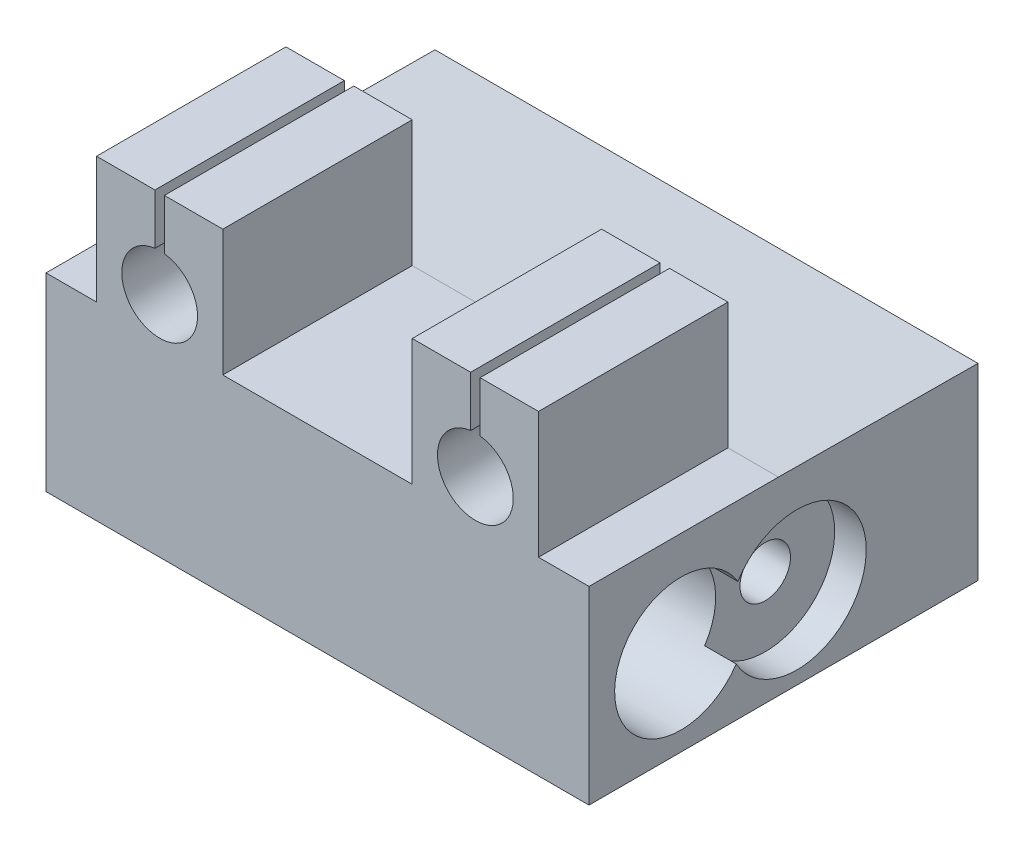
ISO-10303-21;
HEADER;
FILE_DESCRIPTION(('STEP AP214'),'2;1');
FILE_NAME('part.step','',(''),(''),'','','');
FILE_SCHEMA(('AUTOMOTIVE_DESIGN { 1 0 10303 214 1 1 1 1 }'));
ENDSEC;
DATA;
#1=APPLICATION_CONTEXT('core data for automotive mechanical design processes');
#2=APPLICATION_PROTOCOL_DEFINITION('international standard','automotive_design',2000,#1);
#3=PRODUCT_CONTEXT('',#1,'mechanical');
#4=PRODUCT('Part','Part','',(#3));
#5=PRODUCT_RELATED_PRODUCT_CATEGORY('part','',(#4));
#6=PRODUCT_DEFINITION_FORMATION('','',#4);
#7=PRODUCT_DEFINITION_CONTEXT('part definition',#1,'design');
#8=PRODUCT_DEFINITION('design','',#6,#7);
#9=PRODUCT_DEFINITION_SHAPE('','',#8);
#10=(LENGTH_UNIT() NAMED_UNIT(*) SI_UNIT(.MILLI.,.METRE.));
#11=(NAMED_UNIT(*) PLANE_ANGLE_UNIT() SI_UNIT($,.RADIAN.));
#12=(NAMED_UNIT(*) SI_UNIT($,.STERADIAN.) SOLID_ANGLE_UNIT());
#13=UNCERTAINTY_MEASURE_WITH_UNIT(LENGTH_MEASURE(1.E-05),#10,'distance_accuracy_value','');
#14=(GEOMETRIC_REPRESENTATION_CONTEXT(3) GLOBAL_UNCERTAINTY_ASSIGNED_CONTEXT((#13)) GLOBAL_UNIT_ASSIGNED_CONTEXT((#10,
#11,#12)) REPRESENTATION_CONTEXT('',''));
#15=CARTESIAN_POINT('',(0.,0.,0.));
#16=DIRECTION('',(0.,0.,1.));
#17=DIRECTION('',(1.,0.,0.));
#18=AXIS2_PLACEMENT_3D('',#15,#16,#17);
#19=CARTESIAN_POINT('',(54.3137084989848,13.0792641528252,-2.90578026427646));
#20=DIRECTION('',(-1.,0.,0.));
#21=DIRECTION('',(0.,0.,1.));
#22=AXIS2_PLACEMENT_3D('',#19,#20,#21);
#23=CYLINDRICAL_SURFACE('',#22,4.);
#24=CARTESIAN_POINT('',(-38.,13.0792641528252,-2.90578026427646));
#25=DIRECTION('',(-1.,0.,0.));
#26=DIRECTION('',(0.,0.,1.));
#27=AXIS2_PLACEMENT_3D('',#24,#25,#26);
#28=CIRCLE('',#27,4.);
#29=CARTESIAN_POINT('',(-38.,13.0792641528252,1.09421973572354));
#30=VERTEX_POINT('',#29);
#31=EDGE_CURVE('E363',#30,#30,#28,.F.);
#32=ORIENTED_EDGE('',*,*,#31,.F.);
#33=EDGE_LOOP('',(#32));
#34=FACE_BOUND('',#33,.T.);
#35=CARTESIAN_POINT('',(38.,13.0792641528252,-2.90578026427646));
#36=DIRECTION('',(1.,0.,0.));
#37=DIRECTION('',(0.,1.,0.));
#38=AXIS2_PLACEMENT_3D('',#35,#36,#37);
#39=CIRCLE('',#38,4.);
#40=CARTESIAN_POINT('',(38.,17.0792641528252,-2.90578026427646));
#41=VERTEX_POINT('',#40);
#42=EDGE_CURVE('E376',#41,#41,#39,.F.);
#43=ORIENTED_EDGE('',*,*,#42,.F.);
#44=EDGE_LOOP('',(#43));
#45=FACE_BOUND('',#44,.T.);
#46=ADVANCED_FACE('F35',(#34,#45),#23,.F.);
#47=CARTESIAN_POINT('',(-25.,36.0470595501047,0.));
#48=DIRECTION('',(0.,0.,-1.));
#49=DIRECTION('',(-1.,0.,0.));
#50=AXIS2_PLACEMENT_3D('',#47,#48,#49);
#51=PLANE('',#50);
#52=DIRECTION('',(1.,0.,0.));
#53=VECTOR('',#52,1.);
#54=CARTESIAN_POINT('',(-43.,30.,0.));
#55=LINE('',#54,#53);
#56=CARTESIAN_POINT('',(-35.,30.,0.));
#57=VERTEX_POINT('',#56);
#58=CARTESIAN_POINT('',(-15.,30.,0.));
#59=VERTEX_POINT('',#58);
#60=EDGE_CURVE('E371',#57,#59,#55,.T.);
#61=ORIENTED_EDGE('',*,*,#60,.F.);
#62=DIRECTION('',(0.,-1.,0.));
#63=VECTOR('',#62,1.);
#64=CARTESIAN_POINT('',(-35.,30.,0.));
#65=LINE('',#64,#63);
#66=CARTESIAN_POINT('',(-35.,50.,0.));
#67=VERTEX_POINT('',#66);
#68=EDGE_CURVE('E300',#67,#57,#65,.T.);
#69=ORIENTED_EDGE('',*,*,#68,.F.);
#70=DIRECTION('',(-1.,0.,0.));
#71=VECTOR('',#70,1.);
#72=CARTESIAN_POINT('',(-35.,50.,0.));
#73=LINE('',#72,#71);
#74=CARTESIAN_POINT('',(-25.75,50.,0.));
#75=VERTEX_POINT('',#74);
#76=EDGE_CURVE('E298',#75,#67,#73,.T.);
#77=ORIENTED_EDGE('',*,*,#76,.F.);
#78=DIRECTION('',(0.,1.,0.));
#79=VECTOR('',#78,1.);
#80=CARTESIAN_POINT('',(-25.75,50.,0.));
#81=LINE('',#80,#79);
#82=CARTESIAN_POINT('',(-25.75,42.,0.));
#83=VERTEX_POINT('',#82);
#84=EDGE_CURVE('E296',#83,#75,#81,.T.);
#85=ORIENTED_EDGE('',*,*,#84,.F.);
#86=CARTESIAN_POINT('',(-25.,36.0470595501047,0.));
#87=DIRECTION('',(0.,0.,-1.));
#88=DIRECTION('',(-1.,0.,0.));
#89=AXIS2_PLACEMENT_3D('',#86,#87,#88);
#90=CIRCLE('',#89,6.);
#91=CARTESIAN_POINT('',(-24.25,42.,0.));
#92=VERTEX_POINT('',#91);
#93=EDGE_CURVE('E294',#92,#83,#90,.T.);
#94=ORIENTED_EDGE('',*,*,#93,.F.);
#95=DIRECTION('',(0.,-1.,0.));
#96=VECTOR('',#95,1.);
#97=CARTESIAN_POINT('',(-24.25,50.,0.));
#98=LINE('',#97,#96);
#99=CARTESIAN_POINT('',(-24.25,50.,0.));
#100=VERTEX_POINT('',#99);
#101=EDGE_CURVE('E292',#100,#92,#98,.T.);
#102=ORIENTED_EDGE('',*,*,#101,.F.);
#103=DIRECTION('',(-1.,0.,0.));
#104=VECTOR('',#103,1.);
#105=CARTESIAN_POINT('',(-15.,50.,0.));
#106=LINE('',#105,#104);
#107=CARTESIAN_POINT('',(-15.,50.,0.));
#108=VERTEX_POINT('',#107);
#109=EDGE_CURVE('E290',#108,#100,#106,.T.);
#110=ORIENTED_EDGE('',*,*,#109,.F.);
#111=DIRECTION('',(0.,1.,0.));
#112=VECTOR('',#111,1.);
#113=CARTESIAN_POINT('',(-15.,50.,0.));
#114=LINE('',#113,#112);
#115=EDGE_CURVE('E288',#59,#108,#114,.T.);
#116=ORIENTED_EDGE('',*,*,#115,.F.);
#117=EDGE_LOOP('',(#61,#69,#77,#85,#94,#102,#110,#116));
#118=FACE_BOUND('',#117,.T.);
#119=ADVANCED_FACE('F456',(#118),#51,.T.);
#120=CARTESIAN_POINT('',(43.,0.,30.));
#121=DIRECTION('',(0.,1.,0.));
#122=DIRECTION('',(-1.,0.,0.));
#123=AXIS2_PLACEMENT_3D('',#120,#121,#122);
#124=PLANE('',#123);
#125=DIRECTION('',(0.,0.,-1.));
#126=VECTOR('',#125,1.);
#127=CARTESIAN_POINT('',(-43.,0.,30.));
#128=LINE('',#127,#126);
#129=CARTESIAN_POINT('',(-43.,0.,30.));
#130=VERTEX_POINT('',#129);
#131=CARTESIAN_POINT('',(-43.,0.,-31.6003459635326));
#132=VERTEX_POINT('',#131);
#133=EDGE_CURVE('E269',#130,#132,#128,.T.);
#134=ORIENTED_EDGE('',*,*,#133,.T.);
#135=DIRECTION('',(1.,0.,0.));
#136=VECTOR('',#135,1.);
#137=CARTESIAN_POINT('',(-43.,0.,-31.6003459635326));
#138=LINE('',#137,#136);
#139=CARTESIAN_POINT('',(43.,0.,-31.6003459635326));
#140=VERTEX_POINT('',#139);
#141=EDGE_CURVE('E226',#132,#140,#138,.T.);
#142=ORIENTED_EDGE('',*,*,#141,.T.);
#143=DIRECTION('',(0.,0.,-1.));
#144=VECTOR('',#143,1.);
#145=CARTESIAN_POINT('',(43.,0.,30.));
#146=LINE('',#145,#144);
#147=CARTESIAN_POINT('',(43.,0.,30.));
#148=VERTEX_POINT('',#147);
#149=EDGE_CURVE('E360',#148,#140,#146,.T.);
#150=ORIENTED_EDGE('',*,*,#149,.F.);
#151=DIRECTION('',(1.,0.,0.));
#152=VECTOR('',#151,1.);
#153=CARTESIAN_POINT('',(0.,0.,30.));
#154=LINE('',#153,#152);
#155=EDGE_CURVE('E229',#130,#148,#154,.T.);
#156=ORIENTED_EDGE('',*,*,#155,.F.);
#157=EDGE_LOOP('',(#134,#142,#150,#156));
#158=FACE_BOUND('',#157,.T.);
#159=ADVANCED_FACE('F37',(#158),#124,.F.);
#160=CARTESIAN_POINT('',(43.,30.,30.));
#161=DIRECTION('',(-1.,0.,0.));
#162=DIRECTION('',(0.,-1.,0.));
#163=AXIS2_PLACEMENT_3D('',#160,#161,#162);
#164=PLANE('',#163);
#165=CARTESIAN_POINT('',(43.,13.511926698671,15.4452856929028));
#166=DIRECTION('',(-1.,0.,0.));
#167=DIRECTION('',(0.,0.,1.));
#168=AXIS2_PLACEMENT_3D('',#165,#166,#167);
#169=CIRCLE('',#168,10.5);
#170=CARTESIAN_POINT('',(43.,7.70922779874719,6.69436085738838));
#171=VERTEX_POINT('',#170);
#172=CARTESIAN_POINT('',(43.,18.8957666992095,6.43061615660805));
#173=VERTEX_POINT('',#172);
#174=EDGE_CURVE('E212',#171,#173,#169,.T.);
#175=ORIENTED_EDGE('',*,*,#174,.T.);
#176=CARTESIAN_POINT('',(43.,13.0792641528252,-2.90578026427646));
#177=DIRECTION('',(1.,0.,0.));
#178=DIRECTION('',(0.,1.,0.));
#179=AXIS2_PLACEMENT_3D('',#176,#177,#178);
#180=CIRCLE('',#179,11.);
#181=EDGE_CURVE('E201',#171,#173,#180,.T.);
#182=ORIENTED_EDGE('',*,*,#181,.F.);
#183=EDGE_LOOP('',(#175,#182));
#184=FACE_BOUND('',#183,.T.);
#185=ORIENTED_EDGE('',*,*,#149,.T.);
#186=DIRECTION('',(0.,1.,0.));
#187=VECTOR('',#186,1.);
#188=CARTESIAN_POINT('',(43.,0.,-31.6003459635326));
#189=LINE('',#188,#187);
#190=CARTESIAN_POINT('',(43.,29.7919089190263,-31.6003459635326));
#191=VERTEX_POINT('',#190);
#192=EDGE_CURVE('E385',#140,#191,#189,.T.);
#193=ORIENTED_EDGE('',*,*,#192,.T.);
#194=DIRECTION('',(0.,0.00658494592410172,0.999978319008556));
#195=VECTOR('',#194,1.);
#196=CARTESIAN_POINT('',(43.,29.7919089190263,-31.6003459635326));
#197=LINE('',#196,#195);
#198=CARTESIAN_POINT('',(43.,30.,0.));
#199=VERTEX_POINT('',#198);
#200=EDGE_CURVE('E390',#191,#199,#197,.T.);
#201=ORIENTED_EDGE('',*,*,#200,.T.);
#202=DIRECTION('',(0.,0.,-1.));
#203=VECTOR('',#202,1.);
#204=CARTESIAN_POINT('',(43.,30.,30.));
#205=LINE('',#204,#203);
#206=CARTESIAN_POINT('',(43.,30.,30.));
#207=VERTEX_POINT('',#206);
#208=EDGE_CURVE('E357',#207,#199,#205,.T.);
#209=ORIENTED_EDGE('',*,*,#208,.F.);
#210=DIRECTION('',(0.,1.,0.));
#211=VECTOR('',#210,1.);
#212=CARTESIAN_POINT('',(43.,30.,30.));
#213=LINE('',#212,#211);
#214=EDGE_CURVE('E231',#148,#207,#213,.T.);
#215=ORIENTED_EDGE('',*,*,#214,.F.);
#216=EDGE_LOOP('',(#185,#193,#201,#209,#215));
#217=FACE_BOUND('',#216,.T.);
#218=ADVANCED_FACE('F214',(#184,#217),#164,.F.);
#219=CARTESIAN_POINT('',(35.,30.,30.));
#220=DIRECTION('',(0.,-1.,0.));
#221=DIRECTION('',(0.,0.,-1.));
#222=AXIS2_PLACEMENT_3D('',#219,#220,#221);
#223=PLANE('',#222);
#224=DIRECTION('',(-1.,0.,0.));
#225=VECTOR('',#224,1.);
#226=CARTESIAN_POINT('',(35.,30.,0.));
#227=LINE('',#226,#225);
#228=CARTESIAN_POINT('',(35.,30.,0.));
#229=VERTEX_POINT('',#228);
#230=EDGE_CURVE('E216',#199,#229,#227,.T.);
#231=ORIENTED_EDGE('',*,*,#230,.T.);
#232=DIRECTION('',(0.,0.,-1.));
#233=VECTOR('',#232,1.);
#234=CARTESIAN_POINT('',(35.,30.,30.));
#235=LINE('',#234,#233);
#236=CARTESIAN_POINT('',(35.,30.,30.));
#237=VERTEX_POINT('',#236);
#238=EDGE_CURVE('E354',#237,#229,#235,.T.);
#239=ORIENTED_EDGE('',*,*,#238,.F.);
#240=DIRECTION('',(-1.,0.,0.));
#241=VECTOR('',#240,1.);
#242=CARTESIAN_POINT('',(35.,30.,30.));
#243=LINE('',#242,#241);
#244=EDGE_CURVE('E234',#207,#237,#243,.T.);
#245=ORIENTED_EDGE('',*,*,#244,.F.);
#246=ORIENTED_EDGE('',*,*,#208,.T.);
#247=EDGE_LOOP('',(#231,#239,#245,#246));
#248=FACE_BOUND('',#247,.T.);
#249=ADVANCED_FACE('F414',(#248),#223,.F.);
#250=CARTESIAN_POINT('',(35.,50.,30.));
#251=DIRECTION('',(-1.,0.,0.));
#252=DIRECTION('',(0.,0.,1.));
#253=AXIS2_PLACEMENT_3D('',#250,#251,#252);
#254=PLANE('',#253);
#255=DIRECTION('',(0.,1.,0.));
#256=VECTOR('',#255,1.);
#257=CARTESIAN_POINT('',(35.,50.,0.));
#258=LINE('',#257,#256);
#259=CARTESIAN_POINT('',(35.,50.,0.));
#260=VERTEX_POINT('',#259);
#261=EDGE_CURVE('E220',#229,#260,#258,.T.);
#262=ORIENTED_EDGE('',*,*,#261,.T.);
#263=DIRECTION('',(0.,0.,-1.));
#264=VECTOR('',#263,1.);
#265=CARTESIAN_POINT('',(35.,50.,30.));
#266=LINE('',#265,#264);
#267=CARTESIAN_POINT('',(35.,50.,30.));
#268=VERTEX_POINT('',#267);
#269=EDGE_CURVE('E351',#268,#260,#266,.T.);
#270=ORIENTED_EDGE('',*,*,#269,.F.);
#271=DIRECTION('',(0.,1.,0.));
#272=VECTOR('',#271,1.);
#273=CARTESIAN_POINT('',(35.,50.,30.));
#274=LINE('',#273,#272);
#275=EDGE_CURVE('E236',#237,#268,#274,.T.);
#276=ORIENTED_EDGE('',*,*,#275,.F.);
#277=ORIENTED_EDGE('',*,*,#238,.T.);
#278=EDGE_LOOP('',(#262,#270,#276,#277));
#279=FACE_BOUND('',#278,.T.);
#280=ADVANCED_FACE('F419',(#279),#254,.F.);
#281=CARTESIAN_POINT('',(35.,50.,30.));
#282=DIRECTION('',(0.,-1.,0.));
#283=DIRECTION('',(0.,0.,-1.));
#284=AXIS2_PLACEMENT_3D('',#281,#282,#283);
#285=PLANE('',#284);
#286=DIRECTION('',(-1.,0.,0.));
#287=VECTOR('',#286,1.);
#288=CARTESIAN_POINT('',(35.,50.,0.));
#289=LINE('',#288,#287);
#290=CARTESIAN_POINT('',(25.75,50.,0.));
#291=VERTEX_POINT('',#290);
#292=EDGE_CURVE('E272',#260,#291,#289,.T.);
#293=ORIENTED_EDGE('',*,*,#292,.T.);
#294=DIRECTION('',(0.,0.,-1.));
#295=VECTOR('',#294,1.);
#296=CARTESIAN_POINT('',(25.75,50.,30.));
#297=LINE('',#296,#295);
#298=CARTESIAN_POINT('',(25.75,50.,30.));
#299=VERTEX_POINT('',#298);
#300=EDGE_CURVE('E348',#299,#291,#297,.T.);
#301=ORIENTED_EDGE('',*,*,#300,.F.);
#302=DIRECTION('',(-1.,0.,0.));
#303=VECTOR('',#302,1.);
#304=CARTESIAN_POINT('',(35.,50.,30.));
#305=LINE('',#304,#303);
#306=EDGE_CURVE('E238',#268,#299,#305,.T.);
#307=ORIENTED_EDGE('',*,*,#306,.F.);
#308=ORIENTED_EDGE('',*,*,#269,.T.);
#309=EDGE_LOOP('',(#293,#301,#307,#308));
#310=FACE_BOUND('',#309,.T.);
#311=ADVANCED_FACE('F429',(#310),#285,.F.);
#312=CARTESIAN_POINT('',(25.75,50.,30.));
#313=DIRECTION('',(1.,0.,0.));
#314=DIRECTION('',(0.,0.,-1.));
#315=AXIS2_PLACEMENT_3D('',#312,#313,#314);
#316=PLANE('',#315);
#317=DIRECTION('',(0.,-1.,0.));
#318=VECTOR('',#317,1.);
#319=CARTESIAN_POINT('',(25.75,50.,0.));
#320=LINE('',#319,#318);
#321=CARTESIAN_POINT('',(25.75,42.,0.));
#322=VERTEX_POINT('',#321);
#323=EDGE_CURVE('E274',#291,#322,#320,.T.);
#324=ORIENTED_EDGE('',*,*,#323,.T.);
#325=DIRECTION('',(0.,0.,-1.));
#326=VECTOR('',#325,1.);
#327=CARTESIAN_POINT('',(25.75,42.,30.));
#328=LINE('',#327,#326);
#329=CARTESIAN_POINT('',(25.75,42.,30.));
#330=VERTEX_POINT('',#329);
#331=EDGE_CURVE('E345',#330,#322,#328,.T.);
#332=ORIENTED_EDGE('',*,*,#331,.F.);
#333=DIRECTION('',(0.,-1.,0.));
#334=VECTOR('',#333,1.);
#335=CARTESIAN_POINT('',(25.75,50.,30.));
#336=LINE('',#335,#334);
#337=EDGE_CURVE('E240',#299,#330,#336,.T.);
#338=ORIENTED_EDGE('',*,*,#337,.F.);
#339=ORIENTED_EDGE('',*,*,#300,.T.);
#340=EDGE_LOOP('',(#324,#332,#338,#339));
#341=FACE_BOUND('',#340,.T.);
#342=ADVANCED_FACE('F433',(#341),#316,.F.);
#343=CARTESIAN_POINT('',(25.,36.0470595501047,30.));
#344=DIRECTION('',(0.,0.,-1.));
#345=DIRECTION('',(-1.,0.,0.));
#346=AXIS2_PLACEMENT_3D('',#343,#344,#345);
#347=CYLINDRICAL_SURFACE('',#346,6.);
#348=CARTESIAN_POINT('',(25.,36.0470595501047,0.));
#349=DIRECTION('',(0.,0.,-1.));
#350=DIRECTION('',(-1.,0.,0.));
#351=AXIS2_PLACEMENT_3D('',#348,#349,#350);
#352=CIRCLE('',#351,6.);
#353=CARTESIAN_POINT('',(24.25,42.,0.));
#354=VERTEX_POINT('',#353);
#355=EDGE_CURVE('E276',#322,#354,#352,.T.);
#356=ORIENTED_EDGE('',*,*,#355,.T.);
#357=DIRECTION('',(0.,0.,-1.));
#358=VECTOR('',#357,1.);
#359=CARTESIAN_POINT('',(24.25,42.,30.));
#360=LINE('',#359,#358);
#361=CARTESIAN_POINT('',(24.25,42.,30.));
#362=VERTEX_POINT('',#361);
#363=EDGE_CURVE('E342',#362,#354,#360,.T.);
#364=ORIENTED_EDGE('',*,*,#363,.F.);
#365=CARTESIAN_POINT('',(25.,36.0470595501047,30.));
#366=DIRECTION('',(0.,0.,-1.));
#367=DIRECTION('',(-1.,0.,0.));
#368=AXIS2_PLACEMENT_3D('',#365,#366,#367);
#369=CIRCLE('',#368,6.);
#370=EDGE_CURVE('E242',#330,#362,#369,.T.);
#371=ORIENTED_EDGE('',*,*,#370,.F.);
#372=ORIENTED_EDGE('',*,*,#331,.T.);
#373=EDGE_LOOP('',(#356,#364,#371,#372));
#374=FACE_BOUND('',#373,.T.);
#375=ADVANCED_FACE('F485',(#374),#347,.F.);
#376=CARTESIAN_POINT('',(24.25,50.,30.));
#377=DIRECTION('',(-1.,0.,0.));
#378=DIRECTION('',(0.,-1.,0.));
#379=AXIS2_PLACEMENT_3D('',#376,#377,#378);
#380=PLANE('',#379);
#381=DIRECTION('',(0.,1.,0.));
#382=VECTOR('',#381,1.);
#383=CARTESIAN_POINT('',(24.25,50.,0.));
#384=LINE('',#383,#382);
#385=CARTESIAN_POINT('',(24.25,50.,0.));
#386=VERTEX_POINT('',#385);
#387=EDGE_CURVE('E278',#354,#386,#384,.T.);
#388=ORIENTED_EDGE('',*,*,#387,.T.);
#389=DIRECTION('',(0.,0.,-1.));
#390=VECTOR('',#389,1.);
#391=CARTESIAN_POINT('',(24.25,50.,30.));
#392=LINE('',#391,#390);
#393=CARTESIAN_POINT('',(24.25,50.,30.));
#394=VERTEX_POINT('',#393);
#395=EDGE_CURVE('E339',#394,#386,#392,.T.);
#396=ORIENTED_EDGE('',*,*,#395,.F.);
#397=DIRECTION('',(0.,1.,0.));
#398=VECTOR('',#397,1.);
#399=CARTESIAN_POINT('',(24.25,50.,30.));
#400=LINE('',#399,#398);
#401=EDGE_CURVE('E244',#362,#394,#400,.T.);
#402=ORIENTED_EDGE('',*,*,#401,.F.);
#403=ORIENTED_EDGE('',*,*,#363,.T.);
#404=EDGE_LOOP('',(#388,#396,#402,#403));
#405=FACE_BOUND('',#404,.T.);
#406=ADVANCED_FACE('F483',(#405),#380,.F.);
#407=CARTESIAN_POINT('',(15.,50.,30.));
#408=DIRECTION('',(0.,-1.,0.));
#409=DIRECTION('',(0.,0.,-1.));
#410=AXIS2_PLACEMENT_3D('',#407,#408,#409);
#411=PLANE('',#410);
#412=DIRECTION('',(-1.,0.,0.));
#413=VECTOR('',#412,1.);
#414=CARTESIAN_POINT('',(15.,50.,0.));
#415=LINE('',#414,#413);
#416=CARTESIAN_POINT('',(15.,50.,0.));
#417=VERTEX_POINT('',#416);
#418=EDGE_CURVE('E280',#386,#417,#415,.T.);
#419=ORIENTED_EDGE('',*,*,#418,.T.);
#420=DIRECTION('',(0.,0.,-1.));
#421=VECTOR('',#420,1.);
#422=CARTESIAN_POINT('',(15.,50.,30.));
#423=LINE('',#422,#421);
#424=CARTESIAN_POINT('',(15.,50.,30.));
#425=VERTEX_POINT('',#424);
#426=EDGE_CURVE('E336',#425,#417,#423,.T.);
#427=ORIENTED_EDGE('',*,*,#426,.F.);
#428=DIRECTION('',(-1.,0.,0.));
#429=VECTOR('',#428,1.);
#430=CARTESIAN_POINT('',(15.,50.,30.));
#431=LINE('',#430,#429);
#432=EDGE_CURVE('E246',#394,#425,#431,.T.);
#433=ORIENTED_EDGE('',*,*,#432,.F.);
#434=ORIENTED_EDGE('',*,*,#395,.T.);
#435=EDGE_LOOP('',(#419,#427,#433,#434));
#436=FACE_BOUND('',#435,.T.);
#437=ADVANCED_FACE('F479',(#436),#411,.F.);
#438=CARTESIAN_POINT('',(15.,30.,30.));
#439=DIRECTION('',(1.,0.,0.));
#440=DIRECTION('',(0.,1.,0.));
#441=AXIS2_PLACEMENT_3D('',#438,#439,#440);
#442=PLANE('',#441);
#443=DIRECTION('',(0.,-1.,0.));
#444=VECTOR('',#443,1.);
#445=CARTESIAN_POINT('',(15.,30.,0.));
#446=LINE('',#445,#444);
#447=CARTESIAN_POINT('',(15.,30.,0.));
#448=VERTEX_POINT('',#447);
#449=EDGE_CURVE('E282',#417,#448,#446,.T.);
#450=ORIENTED_EDGE('',*,*,#449,.T.);
#451=DIRECTION('',(0.,0.,-1.));
#452=VECTOR('',#451,1.);
#453=CARTESIAN_POINT('',(15.,30.,30.));
#454=LINE('',#453,#452);
#455=CARTESIAN_POINT('',(15.,30.,30.));
#456=VERTEX_POINT('',#455);
#457=EDGE_CURVE('E333',#456,#448,#454,.T.);
#458=ORIENTED_EDGE('',*,*,#457,.F.);
#459=DIRECTION('',(0.,-1.,0.));
#460=VECTOR('',#459,1.);
#461=CARTESIAN_POINT('',(15.,30.,30.));
#462=LINE('',#461,#460);
#463=EDGE_CURVE('E248',#425,#456,#462,.T.);
#464=ORIENTED_EDGE('',*,*,#463,.F.);
#465=ORIENTED_EDGE('',*,*,#426,.T.);
#466=EDGE_LOOP('',(#450,#458,#464,#465));
#467=FACE_BOUND('',#466,.T.);
#468=ADVANCED_FACE('F475',(#467),#442,.F.);
#469=CARTESIAN_POINT('',(-15.,30.,30.));
#470=DIRECTION('',(0.,-1.,0.));
#471=DIRECTION('',(0.,0.,-1.));
#472=AXIS2_PLACEMENT_3D('',#469,#470,#471);
#473=PLANE('',#472);
#474=DIRECTION('',(-1.,0.,0.));
#475=VECTOR('',#474,1.);
#476=CARTESIAN_POINT('',(-15.,30.,0.));
#477=LINE('',#476,#475);
#478=EDGE_CURVE('E285',#448,#59,#477,.T.);
#479=ORIENTED_EDGE('',*,*,#478,.T.);
#480=DIRECTION('',(0.,0.,-1.));
#481=VECTOR('',#480,1.);
#482=CARTESIAN_POINT('',(-15.,30.,30.));
#483=LINE('',#482,#481);
#484=CARTESIAN_POINT('',(-15.,30.,30.));
#485=VERTEX_POINT('',#484);
#486=EDGE_CURVE('E330',#485,#59,#483,.T.);
#487=ORIENTED_EDGE('',*,*,#486,.F.);
#488=DIRECTION('',(-1.,0.,0.));
#489=VECTOR('',#488,1.);
#490=CARTESIAN_POINT('',(0.,30.,30.));
#491=LINE('',#490,#489);
#492=EDGE_CURVE('E250',#456,#485,#491,.T.);
#493=ORIENTED_EDGE('',*,*,#492,.F.);
#494=ORIENTED_EDGE('',*,*,#457,.T.);
#495=EDGE_LOOP('',(#479,#487,#493,#494));
#496=FACE_BOUND('',#495,.T.);
#497=ADVANCED_FACE('F462',(#496),#473,.F.);
#498=CARTESIAN_POINT('',(-15.,50.,30.));
#499=DIRECTION('',(-1.,0.,0.));
#500=DIRECTION('',(0.,0.,1.));
#501=AXIS2_PLACEMENT_3D('',#498,#499,#500);
#502=PLANE('',#501);
#503=ORIENTED_EDGE('',*,*,#115,.T.);
#504=DIRECTION('',(0.,0.,-1.));
#505=VECTOR('',#504,1.);
#506=CARTESIAN_POINT('',(-15.,50.,30.));
#507=LINE('',#506,#505);
#508=CARTESIAN_POINT('',(-15.,50.,30.));
#509=VERTEX_POINT('',#508);
#510=EDGE_CURVE('E327',#509,#108,#507,.T.);
#511=ORIENTED_EDGE('',*,*,#510,.F.);
#512=DIRECTION('',(0.,1.,0.));
#513=VECTOR('',#512,1.);
#514=CARTESIAN_POINT('',(-15.,50.,30.));
#515=LINE('',#514,#513);
#516=EDGE_CURVE('E252',#485,#509,#515,.T.);
#517=ORIENTED_EDGE('',*,*,#516,.F.);
#518=ORIENTED_EDGE('',*,*,#486,.T.);
#519=EDGE_LOOP('',(#503,#511,#517,#518));
#520=FACE_BOUND('',#519,.T.);
#521=ADVANCED_FACE('F467',(#520),#502,.F.);
#522=CARTESIAN_POINT('',(-15.,50.,30.));
#523=DIRECTION('',(0.,-1.,0.));
#524=DIRECTION('',(0.,0.,-1.));
#525=AXIS2_PLACEMENT_3D('',#522,#523,#524);
#526=PLANE('',#525);
#527=ORIENTED_EDGE('',*,*,#109,.T.);
#528=DIRECTION('',(0.,0.,-1.));
#529=VECTOR('',#528,1.);
#530=CARTESIAN_POINT('',(-24.25,50.,30.));
#531=LINE('',#530,#529);
#532=CARTESIAN_POINT('',(-24.25,50.,30.));
#533=VERTEX_POINT('',#532);
#534=EDGE_CURVE('E324',#533,#100,#531,.T.);
#535=ORIENTED_EDGE('',*,*,#534,.F.);
#536=DIRECTION('',(-1.,0.,0.));
#537=VECTOR('',#536,1.);
#538=CARTESIAN_POINT('',(-15.,50.,30.));
#539=LINE('',#538,#537);
#540=EDGE_CURVE('E254',#509,#533,#539,.T.);
#541=ORIENTED_EDGE('',*,*,#540,.F.);
#542=ORIENTED_EDGE('',*,*,#510,.T.);
#543=EDGE_LOOP('',(#527,#535,#541,#542));
#544=FACE_BOUND('',#543,.T.);
#545=ADVANCED_FACE('F538',(#544),#526,.F.);
#546=CARTESIAN_POINT('',(-24.25,50.,30.));
#547=DIRECTION('',(1.,0.,0.));
#548=DIRECTION('',(0.,1.,0.));
#549=AXIS2_PLACEMENT_3D('',#546,#547,#548);
#550=PLANE('',#549);
#551=ORIENTED_EDGE('',*,*,#101,.T.);
#552=DIRECTION('',(0.,0.,-1.));
#553=VECTOR('',#552,1.);
#554=CARTESIAN_POINT('',(-24.25,42.,30.));
#555=LINE('',#554,#553);
#556=CARTESIAN_POINT('',(-24.25,42.,30.));
#557=VERTEX_POINT('',#556);
#558=EDGE_CURVE('E321',#557,#92,#555,.T.);
#559=ORIENTED_EDGE('',*,*,#558,.F.);
#560=DIRECTION('',(0.,-1.,0.));
#561=VECTOR('',#560,1.);
#562=CARTESIAN_POINT('',(-24.25,50.,30.));
#563=LINE('',#562,#561);
#564=EDGE_CURVE('E256',#533,#557,#563,.T.);
#565=ORIENTED_EDGE('',*,*,#564,.F.);
#566=ORIENTED_EDGE('',*,*,#534,.T.);
#567=EDGE_LOOP('',(#551,#559,#565,#566));
#568=FACE_BOUND('',#567,.T.);
#569=ADVANCED_FACE('F534',(#568),#550,.F.);
#570=CARTESIAN_POINT('',(-25.,36.0470595501047,30.));
#571=DIRECTION('',(0.,0.,-1.));
#572=DIRECTION('',(-1.,0.,0.));
#573=AXIS2_PLACEMENT_3D('',#570,#571,#572);
#574=CYLINDRICAL_SURFACE('',#573,6.);
#575=ORIENTED_EDGE('',*,*,#93,.T.);
#576=DIRECTION('',(0.,0.,-1.));
#577=VECTOR('',#576,1.);
#578=CARTESIAN_POINT('',(-25.75,42.,30.));
#579=LINE('',#578,#577);
#580=CARTESIAN_POINT('',(-25.75,42.,30.));
#581=VERTEX_POINT('',#580);
#582=EDGE_CURVE('E318',#581,#83,#579,.T.);
#583=ORIENTED_EDGE('',*,*,#582,.F.);
#584=CARTESIAN_POINT('',(-25.,36.0470595501047,30.));
#585=DIRECTION('',(0.,0.,-1.));
#586=DIRECTION('',(-1.,0.,0.));
#587=AXIS2_PLACEMENT_3D('',#584,#585,#586);
#588=CIRCLE('',#587,6.);
#589=EDGE_CURVE('E258',#557,#581,#588,.T.);
#590=ORIENTED_EDGE('',*,*,#589,.F.);
#591=ORIENTED_EDGE('',*,*,#558,.T.);
#592=EDGE_LOOP('',(#575,#583,#590,#591));
#593=FACE_BOUND('',#592,.T.);
#594=ADVANCED_FACE('F530',(#593),#574,.F.);
#595=CARTESIAN_POINT('',(-25.75,50.,30.));
#596=DIRECTION('',(-1.,0.,0.));
#597=DIRECTION('',(0.,0.,1.));
#598=AXIS2_PLACEMENT_3D('',#595,#596,#597);
#599=PLANE('',#598);
#600=ORIENTED_EDGE('',*,*,#84,.T.);
#601=DIRECTION('',(0.,0.,-1.));
#602=VECTOR('',#601,1.);
#603=CARTESIAN_POINT('',(-25.75,50.,30.));
#604=LINE('',#603,#602);
#605=CARTESIAN_POINT('',(-25.75,50.,30.));
#606=VERTEX_POINT('',#605);
#607=EDGE_CURVE('E315',#606,#75,#604,.T.);
#608=ORIENTED_EDGE('',*,*,#607,.F.);
#609=DIRECTION('',(0.,1.,0.));
#610=VECTOR('',#609,1.);
#611=CARTESIAN_POINT('',(-25.75,50.,30.));
#612=LINE('',#611,#610);
#613=EDGE_CURVE('E260',#581,#606,#612,.T.);
#614=ORIENTED_EDGE('',*,*,#613,.F.);
#615=ORIENTED_EDGE('',*,*,#582,.T.);
#616=EDGE_LOOP('',(#600,#608,#614,#615));
#617=FACE_BOUND('',#616,.T.);
#618=ADVANCED_FACE('F526',(#617),#599,.F.);
#619=CARTESIAN_POINT('',(-35.,50.,30.));
#620=DIRECTION('',(0.,-1.,0.));
#621=DIRECTION('',(0.,0.,-1.));
#622=AXIS2_PLACEMENT_3D('',#619,#620,#621);
#623=PLANE('',#622);
#624=ORIENTED_EDGE('',*,*,#76,.T.);
#625=DIRECTION('',(0.,0.,-1.));
#626=VECTOR('',#625,1.);
#627=CARTESIAN_POINT('',(-35.,50.,30.));
#628=LINE('',#627,#626);
#629=CARTESIAN_POINT('',(-35.,50.,30.));
#630=VERTEX_POINT('',#629);
#631=EDGE_CURVE('E312',#630,#67,#628,.T.);
#632=ORIENTED_EDGE('',*,*,#631,.F.);
#633=DIRECTION('',(-1.,0.,0.));
#634=VECTOR('',#633,1.);
#635=CARTESIAN_POINT('',(-35.,50.,30.));
#636=LINE('',#635,#634);
#637=EDGE_CURVE('E262',#606,#630,#636,.T.);
#638=ORIENTED_EDGE('',*,*,#637,.F.);
#639=ORIENTED_EDGE('',*,*,#607,.T.);
#640=EDGE_LOOP('',(#624,#632,#638,#639));
#641=FACE_BOUND('',#640,.T.);
#642=ADVANCED_FACE('F523',(#641),#623,.F.);
#643=CARTESIAN_POINT('',(-35.,30.,30.));
#644=DIRECTION('',(1.,0.,0.));
#645=DIRECTION('',(0.,0.,-1.));
#646=AXIS2_PLACEMENT_3D('',#643,#644,#645);
#647=PLANE('',#646);
#648=ORIENTED_EDGE('',*,*,#68,.T.);
#649=DIRECTION('',(0.,0.,-1.));
#650=VECTOR('',#649,1.);
#651=CARTESIAN_POINT('',(-35.,30.,30.));
#652=LINE('',#651,#650);
#653=CARTESIAN_POINT('',(-35.,30.,30.));
#654=VERTEX_POINT('',#653);
#655=EDGE_CURVE('E309',#654,#57,#652,.T.);
#656=ORIENTED_EDGE('',*,*,#655,.F.);
#657=DIRECTION('',(0.,-1.,0.));
#658=VECTOR('',#657,1.);
#659=CARTESIAN_POINT('',(-35.,30.,30.));
#660=LINE('',#659,#658);
#661=EDGE_CURVE('E264',#630,#654,#660,.T.);
#662=ORIENTED_EDGE('',*,*,#661,.F.);
#663=ORIENTED_EDGE('',*,*,#631,.T.);
#664=EDGE_LOOP('',(#648,#656,#662,#663));
#665=FACE_BOUND('',#664,.T.);
#666=ADVANCED_FACE('F451',(#665),#647,.F.);
#667=CARTESIAN_POINT('',(-43.,30.,30.));
#668=DIRECTION('',(0.,-1.,0.));
#669=DIRECTION('',(0.,0.,-1.));
#670=AXIS2_PLACEMENT_3D('',#667,#668,#669);
#671=PLANE('',#670);
#672=DIRECTION('',(-1.,0.,0.));
#673=VECTOR('',#672,1.);
#674=CARTESIAN_POINT('',(-43.,30.,0.));
#675=LINE('',#674,#673);
#676=CARTESIAN_POINT('',(-43.,30.,0.));
#677=VERTEX_POINT('',#676);
#678=EDGE_CURVE('E232',#57,#677,#675,.T.);
#679=ORIENTED_EDGE('',*,*,#678,.T.);
#680=DIRECTION('',(0.,0.,-1.));
#681=VECTOR('',#680,1.);
#682=CARTESIAN_POINT('',(-43.,30.,30.));
#683=LINE('',#682,#681);
#684=CARTESIAN_POINT('',(-43.,30.,30.));
#685=VERTEX_POINT('',#684);
#686=EDGE_CURVE('E306',#685,#677,#683,.T.);
#687=ORIENTED_EDGE('',*,*,#686,.F.);
#688=DIRECTION('',(-1.,0.,0.));
#689=VECTOR('',#688,1.);
#690=CARTESIAN_POINT('',(-43.,30.,30.));
#691=LINE('',#690,#689);
#692=EDGE_CURVE('E266',#654,#685,#691,.T.);
#693=ORIENTED_EDGE('',*,*,#692,.F.);
#694=ORIENTED_EDGE('',*,*,#655,.T.);
#695=EDGE_LOOP('',(#679,#687,#693,#694));
#696=FACE_BOUND('',#695,.T.);
#697=ADVANCED_FACE('F447',(#696),#671,.F.);
#698=CARTESIAN_POINT('',(-43.,0.,30.));
#699=DIRECTION('',(1.,0.,0.));
#700=DIRECTION('',(0.,0.,-1.));
#701=AXIS2_PLACEMENT_3D('',#698,#699,#700);
#702=PLANE('',#701);
#703=CARTESIAN_POINT('',(-43.,13.511926698671,15.4452856929028));
#704=DIRECTION('',(-1.,0.,0.));
#705=DIRECTION('',(0.,0.,1.));
#706=AXIS2_PLACEMENT_3D('',#703,#704,#705);
#707=CIRCLE('',#706,10.5);
#708=CARTESIAN_POINT('',(-43.,7.70922779874719,6.69436085738838));
#709=VERTEX_POINT('',#708);
#710=CARTESIAN_POINT('',(-43.,18.8957666992095,6.43061615660805));
#711=VERTEX_POINT('',#710);
#712=EDGE_CURVE('E217',#709,#711,#707,.T.);
#713=ORIENTED_EDGE('',*,*,#712,.F.);
#714=CARTESIAN_POINT('',(-43.,13.0792641528252,-2.90578026427646));
#715=DIRECTION('',(-1.,0.,0.));
#716=DIRECTION('',(0.,0.,1.));
#717=AXIS2_PLACEMENT_3D('',#714,#715,#716);
#718=CIRCLE('',#717,11.);
#719=EDGE_CURVE('E379',#711,#709,#718,.T.);
#720=ORIENTED_EDGE('',*,*,#719,.F.);
#721=EDGE_LOOP('',(#713,#720));
#722=FACE_BOUND('',#721,.T.);
#723=ORIENTED_EDGE('',*,*,#686,.T.);
#724=DIRECTION('',(0.,0.00658494592410172,0.999978319008556));
#725=VECTOR('',#724,1.);
#726=CARTESIAN_POINT('',(-43.,29.7919089190263,-31.6003459635326));
#727=LINE('',#726,#725);
#728=CARTESIAN_POINT('',(-43.,29.7919089190263,-31.6003459635326));
#729=VERTEX_POINT('',#728);
#730=EDGE_CURVE('E389',#729,#677,#727,.T.);
#731=ORIENTED_EDGE('',*,*,#730,.F.);
#732=DIRECTION('',(0.,1.,0.));
#733=VECTOR('',#732,1.);
#734=CARTESIAN_POINT('',(-43.,0.,-31.6003459635326));
#735=LINE('',#734,#733);
#736=EDGE_CURVE('E386',#132,#729,#735,.T.);
#737=ORIENTED_EDGE('',*,*,#736,.F.);
#738=ORIENTED_EDGE('',*,*,#133,.F.);
#739=DIRECTION('',(0.,-1.,0.));
#740=VECTOR('',#739,1.);
#741=CARTESIAN_POINT('',(-43.,0.,30.));
#742=LINE('',#741,#740);
#743=EDGE_CURVE('E268',#685,#130,#742,.T.);
#744=ORIENTED_EDGE('',*,*,#743,.F.);
#745=EDGE_LOOP('',(#723,#731,#737,#738,#744));
#746=FACE_BOUND('',#745,.T.);
#747=ADVANCED_FACE('F443',(#722,#746),#702,.F.);
#748=CARTESIAN_POINT('',(-25.,36.0470595501047,30.));
#749=DIRECTION('',(0.,0.,-1.));
#750=DIRECTION('',(-1.,0.,0.));
#751=AXIS2_PLACEMENT_3D('',#748,#749,#750);
#752=PLANE('',#751);
#753=ORIENTED_EDGE('',*,*,#155,.T.);
#754=ORIENTED_EDGE('',*,*,#214,.T.);
#755=ORIENTED_EDGE('',*,*,#244,.T.);
#756=ORIENTED_EDGE('',*,*,#275,.T.);
#757=ORIENTED_EDGE('',*,*,#306,.T.);
#758=ORIENTED_EDGE('',*,*,#337,.T.);
#759=ORIENTED_EDGE('',*,*,#370,.T.);
#760=ORIENTED_EDGE('',*,*,#401,.T.);
#761=ORIENTED_EDGE('',*,*,#432,.T.);
#762=ORIENTED_EDGE('',*,*,#463,.T.);
#763=ORIENTED_EDGE('',*,*,#492,.T.);
#764=ORIENTED_EDGE('',*,*,#516,.T.);
#765=ORIENTED_EDGE('',*,*,#540,.T.);
#766=ORIENTED_EDGE('',*,*,#564,.T.);
#767=ORIENTED_EDGE('',*,*,#589,.T.);
#768=ORIENTED_EDGE('',*,*,#613,.T.);
#769=ORIENTED_EDGE('',*,*,#637,.T.);
#770=ORIENTED_EDGE('',*,*,#661,.T.);
#771=ORIENTED_EDGE('',*,*,#692,.T.);
#772=ORIENTED_EDGE('',*,*,#743,.T.);
#773=EDGE_LOOP('',(#753,#754,#755,#756,#757,#758,#759,#760,#761,#762,#763,#764,#765,#766,#767,
#768,#769,#770,#771,#772));
#774=FACE_BOUND('',#773,.T.);
#775=ADVANCED_FACE('F437',(#774),#752,.F.);
#776=EDGE_CURVE('E362',#448,#229,#55,.T.);
#777=ORIENTED_EDGE('',*,*,#776,.F.);
#778=ORIENTED_EDGE('',*,*,#449,.F.);
#779=ORIENTED_EDGE('',*,*,#418,.F.);
#780=ORIENTED_EDGE('',*,*,#387,.F.);
#781=ORIENTED_EDGE('',*,*,#355,.F.);
#782=ORIENTED_EDGE('',*,*,#323,.F.);
#783=ORIENTED_EDGE('',*,*,#292,.F.);
#784=ORIENTED_EDGE('',*,*,#261,.F.);
#785=EDGE_LOOP('',(#777,#778,#779,#780,#781,#782,#783,#784));
#786=FACE_BOUND('',#785,.T.);
#787=ADVANCED_FACE('F423',(#786),#51,.T.);
#788=CARTESIAN_POINT('',(43.,13.511926698671,15.4452856929028));
#789=DIRECTION('',(-1.,0.,0.));
#790=DIRECTION('',(0.,0.,1.));
#791=AXIS2_PLACEMENT_3D('',#788,#789,#790);
#792=CYLINDRICAL_SURFACE('',#791,10.5);
#793=ORIENTED_EDGE('',*,*,#174,.F.);
#794=DIRECTION('',(1.,0.,0.));
#795=VECTOR('',#794,1.);
#796=CARTESIAN_POINT('',(40.5,7.70922779874719,6.69436085738838));
#797=LINE('',#796,#795);
#798=CARTESIAN_POINT('',(38.,7.70922779874719,6.69436085738838));
#799=VERTEX_POINT('',#798);
#800=EDGE_CURVE('E11',#171,#799,#797,.F.);
#801=ORIENTED_EDGE('',*,*,#800,.T.);
#802=CARTESIAN_POINT('',(38.,13.511926698671,15.4452856929028));
#803=DIRECTION('',(1.,0.,0.));
#804=DIRECTION('',(0.,1.,0.));
#805=AXIS2_PLACEMENT_3D('',#802,#803,#804);
#806=CIRCLE('',#805,10.5);
#807=CARTESIAN_POINT('',(38.,18.8957666992095,6.43061615660805));
#808=VERTEX_POINT('',#807);
#809=EDGE_CURVE('E213',#808,#799,#806,.F.);
#810=ORIENTED_EDGE('',*,*,#809,.F.);
#811=DIRECTION('',(1.,0.,0.));
#812=VECTOR('',#811,1.);
#813=CARTESIAN_POINT('',(40.5,18.8957666992095,6.43061615660805));
#814=LINE('',#813,#812);
#815=EDGE_CURVE('E43',#808,#173,#814,.T.);
#816=ORIENTED_EDGE('',*,*,#815,.T.);
#817=EDGE_LOOP('',(#793,#801,#810,#816));
#818=FACE_BOUND('',#817,.T.);
#819=CARTESIAN_POINT('',(-38.,13.511926698671,15.4452856929028));
#820=DIRECTION('',(-1.,0.,0.));
#821=DIRECTION('',(0.,0.,1.));
#822=AXIS2_PLACEMENT_3D('',#819,#820,#821);
#823=CIRCLE('',#822,10.5);
#824=CARTESIAN_POINT('',(-38.,7.70922779874719,6.69436085738838));
#825=VERTEX_POINT('',#824);
#826=CARTESIAN_POINT('',(-38.,18.8957666992095,6.43061615660805));
#827=VERTEX_POINT('',#826);
#828=EDGE_CURVE('E366',#825,#827,#823,.F.);
#829=ORIENTED_EDGE('',*,*,#828,.F.);
#830=DIRECTION('',(-1.,0.,0.));
#831=VECTOR('',#830,1.);
#832=CARTESIAN_POINT('',(-40.5,7.70922779874719,6.69436085738838));
#833=LINE('',#832,#831);
#834=EDGE_CURVE('E370',#825,#709,#833,.T.);
#835=ORIENTED_EDGE('',*,*,#834,.T.);
#836=ORIENTED_EDGE('',*,*,#712,.T.);
#837=DIRECTION('',(-1.,0.,0.));
#838=VECTOR('',#837,1.);
#839=CARTESIAN_POINT('',(-40.5,18.8957666992095,6.43061615660805));
#840=LINE('',#839,#838);
#841=EDGE_CURVE('E367',#711,#827,#840,.F.);
#842=ORIENTED_EDGE('',*,*,#841,.T.);
#843=EDGE_LOOP('',(#829,#835,#836,#842));
#844=FACE_BOUND('',#843,.T.);
#845=ADVANCED_FACE('F210',(#818,#844),#792,.F.);
#846=CARTESIAN_POINT('',(-43.,29.7919089190263,-31.6003459635326));
#847=DIRECTION('',(0.,0.999978319008556,-0.00658494592410172));
#848=DIRECTION('',(0.,0.00658494592410172,0.999978319008556));
#849=AXIS2_PLACEMENT_3D('',#846,#847,#848);
#850=PLANE('',#849);
#851=ORIENTED_EDGE('',*,*,#200,.F.);
#852=DIRECTION('',(1.,0.,0.));
#853=VECTOR('',#852,1.);
#854=CARTESIAN_POINT('',(-43.,29.7919089190263,-31.6003459635326));
#855=LINE('',#854,#853);
#856=EDGE_CURVE('E223',#729,#191,#855,.T.);
#857=ORIENTED_EDGE('',*,*,#856,.F.);
#858=ORIENTED_EDGE('',*,*,#730,.T.);
#859=ORIENTED_EDGE('',*,*,#678,.F.);
#860=ORIENTED_EDGE('',*,*,#60,.T.);
#861=ORIENTED_EDGE('',*,*,#478,.F.);
#862=ORIENTED_EDGE('',*,*,#776,.T.);
#863=ORIENTED_EDGE('',*,*,#230,.F.);
#864=EDGE_LOOP('',(#851,#857,#858,#859,#860,#861,#862,#863));
#865=FACE_BOUND('',#864,.T.);
#866=ADVANCED_FACE('F410',(#865),#850,.T.);
#867=CARTESIAN_POINT('',(-43.,0.,-31.6003459635326));
#868=DIRECTION('',(0.,0.,-1.));
#869=DIRECTION('',(-1.,0.,0.));
#870=AXIS2_PLACEMENT_3D('',#867,#868,#869);
#871=PLANE('',#870);
#872=ORIENTED_EDGE('',*,*,#192,.F.);
#873=ORIENTED_EDGE('',*,*,#141,.F.);
#874=ORIENTED_EDGE('',*,*,#736,.T.);
#875=ORIENTED_EDGE('',*,*,#856,.T.);
#876=EDGE_LOOP('',(#872,#873,#874,#875));
#877=FACE_BOUND('',#876,.T.);
#878=ADVANCED_FACE('F406',(#877),#871,.T.);
#879=CARTESIAN_POINT('',(-38.,13.0792641528252,-2.90578026427646));
#880=DIRECTION('',(-1.,0.,0.));
#881=DIRECTION('',(0.,0.,1.));
#882=AXIS2_PLACEMENT_3D('',#879,#880,#881);
#883=CYLINDRICAL_SURFACE('',#882,11.);
#884=CARTESIAN_POINT('',(-38.,13.0792641528252,-2.90578026427646));
#885=DIRECTION('',(-1.,0.,0.));
#886=DIRECTION('',(0.,0.,1.));
#887=AXIS2_PLACEMENT_3D('',#884,#885,#886);
#888=CIRCLE('',#887,11.);
#889=EDGE_CURVE('E56',#827,#825,#888,.T.);
#890=ORIENTED_EDGE('',*,*,#889,.F.);
#891=ORIENTED_EDGE('',*,*,#841,.F.);
#892=ORIENTED_EDGE('',*,*,#719,.T.);
#893=ORIENTED_EDGE('',*,*,#834,.F.);
#894=EDGE_LOOP('',(#890,#891,#892,#893));
#895=FACE_BOUND('',#894,.T.);
#896=ADVANCED_FACE('F505',(#895),#883,.F.);
#897=CARTESIAN_POINT('',(-38.,13.0792641528252,-2.90578026427646));
#898=DIRECTION('',(-1.,0.,0.));
#899=DIRECTION('',(0.,0.,1.));
#900=AXIS2_PLACEMENT_3D('',#897,#898,#899);
#901=PLANE('',#900);
#902=ORIENTED_EDGE('',*,*,#31,.T.);
#903=EDGE_LOOP('',(#902));
#904=FACE_BOUND('',#903,.T.);
#905=ORIENTED_EDGE('',*,*,#828,.T.);
#906=ORIENTED_EDGE('',*,*,#889,.T.);
#907=EDGE_LOOP('',(#905,#906));
#908=FACE_BOUND('',#907,.T.);
#909=ADVANCED_FACE('F628',(#904,#908),#901,.T.);
#910=CARTESIAN_POINT('',(38.,13.0792641528252,-2.90578026427646));
#911=DIRECTION('',(1.,0.,0.));
#912=DIRECTION('',(0.,1.,0.));
#913=AXIS2_PLACEMENT_3D('',#910,#911,#912);
#914=CYLINDRICAL_SURFACE('',#913,11.);
#915=ORIENTED_EDGE('',*,*,#181,.T.);
#916=ORIENTED_EDGE('',*,*,#815,.F.);
#917=CARTESIAN_POINT('',(38.,13.0792641528252,-2.90578026427646));
#918=DIRECTION('',(1.,0.,0.));
#919=DIRECTION('',(0.,1.,0.));
#920=AXIS2_PLACEMENT_3D('',#917,#918,#919);
#921=CIRCLE('',#920,11.);
#922=EDGE_CURVE('E49',#799,#808,#921,.T.);
#923=ORIENTED_EDGE('',*,*,#922,.F.);
#924=ORIENTED_EDGE('',*,*,#800,.F.);
#925=EDGE_LOOP('',(#915,#916,#923,#924));
#926=FACE_BOUND('',#925,.T.);
#927=ADVANCED_FACE('F203',(#926),#914,.F.);
#928=CARTESIAN_POINT('',(38.,13.0792641528252,-2.90578026427646));
#929=DIRECTION('',(1.,0.,0.));
#930=DIRECTION('',(0.,1.,0.));
#931=AXIS2_PLACEMENT_3D('',#928,#929,#930);
#932=PLANE('',#931);
#933=ORIENTED_EDGE('',*,*,#809,.T.);
#934=ORIENTED_EDGE('',*,*,#922,.T.);
#935=EDGE_LOOP('',(#933,#934));
#936=FACE_BOUND('',#935,.T.);
#937=ORIENTED_EDGE('',*,*,#42,.T.);
#938=EDGE_LOOP('',(#937));
#939=FACE_BOUND('',#938,.T.);
#940=ADVANCED_FACE('F374',(#936,#939),#932,.T.);
#941=CLOSED_SHELL('',(#46,#119,#159,#218,#249,#280,#311,#342,#375,#406,#437,#468,#497,#521,#545,
#569,#594,#618,#642,#666,#697,#747,#775,#787,#845,#866,#878,#896,#909,#927,#940));
#942=MANIFOLD_SOLID_BREP('B2',#941);
#943=ADVANCED_BREP_SHAPE_REPRESENTATION('',(#18,#942),#14);
#944=SHAPE_DEFINITION_REPRESENTATION(#9,#943);
ENDSEC;
END-ISO-10303-21;
